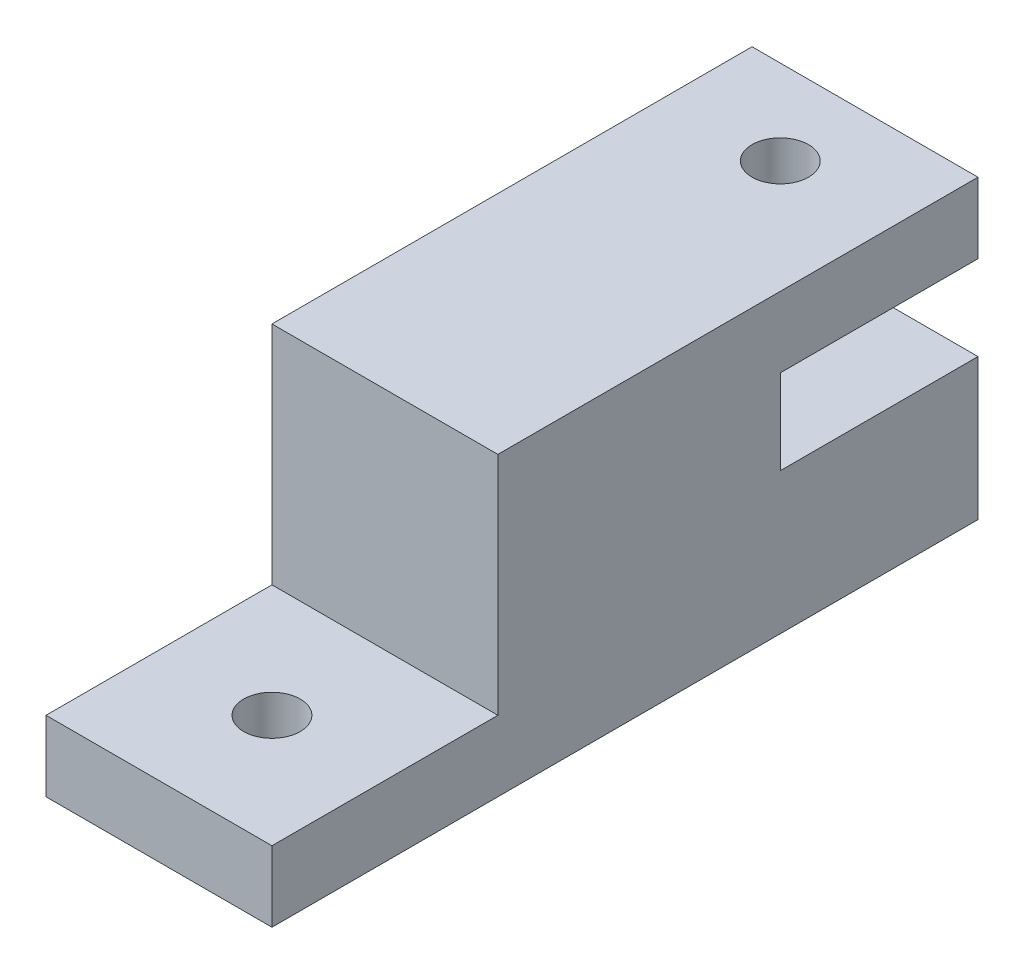
ISO-10303-21;
HEADER;
FILE_DESCRIPTION(('STEP AP214'),'2;1');
FILE_NAME('part.step','',(''),(''),'','','');
FILE_SCHEMA(('AUTOMOTIVE_DESIGN { 1 0 10303 214 1 1 1 1 }'));
ENDSEC;
DATA;
#1=APPLICATION_CONTEXT('core data for automotive mechanical design processes');
#2=APPLICATION_PROTOCOL_DEFINITION('international standard','automotive_design',2000,#1);
#3=PRODUCT_CONTEXT('',#1,'mechanical');
#4=PRODUCT('Part','Part','',(#3));
#5=PRODUCT_RELATED_PRODUCT_CATEGORY('part','',(#4));
#6=PRODUCT_DEFINITION_FORMATION('','',#4);
#7=PRODUCT_DEFINITION_CONTEXT('part definition',#1,'design');
#8=PRODUCT_DEFINITION('design','',#6,#7);
#9=PRODUCT_DEFINITION_SHAPE('','',#8);
#10=(LENGTH_UNIT() NAMED_UNIT(*) SI_UNIT(.MILLI.,.METRE.));
#11=(NAMED_UNIT(*) PLANE_ANGLE_UNIT() SI_UNIT($,.RADIAN.));
#12=(NAMED_UNIT(*) SI_UNIT($,.STERADIAN.) SOLID_ANGLE_UNIT());
#13=UNCERTAINTY_MEASURE_WITH_UNIT(LENGTH_MEASURE(1.E-05),#10,'distance_accuracy_value','');
#14=(GEOMETRIC_REPRESENTATION_CONTEXT(3) GLOBAL_UNCERTAINTY_ASSIGNED_CONTEXT((#13)) GLOBAL_UNIT_ASSIGNED_CONTEXT((#10,
#11,#12)) REPRESENTATION_CONTEXT('',''));
#15=CARTESIAN_POINT('',(0.,0.,0.));
#16=DIRECTION('',(0.,0.,1.));
#17=DIRECTION('',(1.,0.,0.));
#18=AXIS2_PLACEMENT_3D('',#15,#16,#17);
#19=CARTESIAN_POINT('',(12.7,25.4,0.));
#20=DIRECTION('',(0.,0.,-1.));
#21=DIRECTION('',(0.,1.,0.));
#22=AXIS2_PLACEMENT_3D('',#19,#20,#21);
#23=PLANE('',#22);
#24=DIRECTION('',(0.,-1.,0.));
#25=VECTOR('',#24,1.);
#26=CARTESIAN_POINT('',(-12.7,25.4,0.));
#27=LINE('',#26,#25);
#28=CARTESIAN_POINT('',(-12.7,25.4,0.));
#29=VERTEX_POINT('',#28);
#30=CARTESIAN_POINT('',(-12.7,0.,0.));
#31=VERTEX_POINT('',#30);
#32=EDGE_CURVE('E148',#29,#31,#27,.T.);
#33=ORIENTED_EDGE('',*,*,#32,.T.);
#34=DIRECTION('',(-1.,0.,0.));
#35=VECTOR('',#34,1.);
#36=CARTESIAN_POINT('',(12.7,0.,0.));
#37=LINE('',#36,#35);
#38=CARTESIAN_POINT('',(12.7,0.,0.));
#39=VERTEX_POINT('',#38);
#40=EDGE_CURVE('E12',#39,#31,#37,.T.);
#41=ORIENTED_EDGE('',*,*,#40,.F.);
#42=DIRECTION('',(0.,-1.,0.));
#43=VECTOR('',#42,1.);
#44=CARTESIAN_POINT('',(12.7,25.4,0.));
#45=LINE('',#44,#43);
#46=CARTESIAN_POINT('',(12.7,25.4,0.));
#47=VERTEX_POINT('',#46);
#48=EDGE_CURVE('E167',#47,#39,#45,.T.);
#49=ORIENTED_EDGE('',*,*,#48,.F.);
#50=DIRECTION('',(-1.,0.,0.));
#51=VECTOR('',#50,1.);
#52=CARTESIAN_POINT('',(12.7,25.4,0.));
#53=LINE('',#52,#51);
#54=EDGE_CURVE('E144',#47,#29,#53,.T.);
#55=ORIENTED_EDGE('',*,*,#54,.T.);
#56=EDGE_LOOP('',(#33,#41,#49,#55));
#57=FACE_BOUND('',#56,.T.);
#58=ADVANCED_FACE('F40',(#57),#23,.F.);
#59=CARTESIAN_POINT('',(12.7,0.,0.));
#60=DIRECTION('',(0.,-1.,0.));
#61=DIRECTION('',(0.,0.,-1.));
#62=AXIS2_PLACEMENT_3D('',#59,#60,#61);
#63=PLANE('',#62);
#64=CARTESIAN_POINT('',(0.,0.,12.7));
#65=DIRECTION('',(0.,-1.,0.));
#66=DIRECTION('',(0.,0.,-1.));
#67=AXIS2_PLACEMENT_3D('',#64,#65,#66);
#68=CIRCLE('',#67,3.175);
#69=CARTESIAN_POINT('',(0.,0.,9.525));
#70=VERTEX_POINT('',#69);
#71=EDGE_CURVE('E223',#70,#70,#68,.T.);
#72=ORIENTED_EDGE('',*,*,#71,.T.);
#73=EDGE_LOOP('',(#72));
#74=FACE_BOUND('',#73,.T.);
#75=DIRECTION('',(0.,0.,1.));
#76=VECTOR('',#75,1.);
#77=CARTESIAN_POINT('',(-12.7,0.,0.));
#78=LINE('',#77,#76);
#79=CARTESIAN_POINT('',(-12.7,0.,25.4));
#80=VERTEX_POINT('',#79);
#81=EDGE_CURVE('E151',#31,#80,#78,.T.);
#82=ORIENTED_EDGE('',*,*,#81,.T.);
#83=DIRECTION('',(-1.,0.,0.));
#84=VECTOR('',#83,1.);
#85=CARTESIAN_POINT('',(12.7,0.,25.4));
#86=LINE('',#85,#84);
#87=CARTESIAN_POINT('',(12.7,0.,25.4));
#88=VERTEX_POINT('',#87);
#89=EDGE_CURVE('E48',#88,#80,#86,.T.);
#90=ORIENTED_EDGE('',*,*,#89,.F.);
#91=DIRECTION('',(0.,0.,1.));
#92=VECTOR('',#91,1.);
#93=CARTESIAN_POINT('',(12.7,0.,0.));
#94=LINE('',#93,#92);
#95=EDGE_CURVE('E105',#39,#88,#94,.T.);
#96=ORIENTED_EDGE('',*,*,#95,.F.);
#97=ORIENTED_EDGE('',*,*,#40,.T.);
#98=EDGE_LOOP('',(#82,#90,#96,#97));
#99=FACE_BOUND('',#98,.T.);
#100=ADVANCED_FACE('F241',(#74,#99),#63,.F.);
#101=CARTESIAN_POINT('',(12.7,0.,25.4));
#102=DIRECTION('',(0.,0.,-1.));
#103=DIRECTION('',(-1.,0.,0.));
#104=AXIS2_PLACEMENT_3D('',#101,#102,#103);
#105=PLANE('',#104);
#106=DIRECTION('',(0.,-1.,0.));
#107=VECTOR('',#106,1.);
#108=CARTESIAN_POINT('',(-12.7,0.,25.4));
#109=LINE('',#108,#107);
#110=CARTESIAN_POINT('',(-12.7,-7.9375,25.4));
#111=VERTEX_POINT('',#110);
#112=EDGE_CURVE('E154',#80,#111,#109,.T.);
#113=ORIENTED_EDGE('',*,*,#112,.T.);
#114=DIRECTION('',(-1.,0.,0.));
#115=VECTOR('',#114,1.);
#116=CARTESIAN_POINT('',(12.7,-7.9375,25.4));
#117=LINE('',#116,#115);
#118=CARTESIAN_POINT('',(12.7,-7.9375,25.4));
#119=VERTEX_POINT('',#118);
#120=EDGE_CURVE('E180',#119,#111,#117,.T.);
#121=ORIENTED_EDGE('',*,*,#120,.F.);
#122=DIRECTION('',(0.,-1.,0.));
#123=VECTOR('',#122,1.);
#124=CARTESIAN_POINT('',(12.7,0.,25.4));
#125=LINE('',#124,#123);
#126=EDGE_CURVE('E188',#88,#119,#125,.T.);
#127=ORIENTED_EDGE('',*,*,#126,.F.);
#128=ORIENTED_EDGE('',*,*,#89,.T.);
#129=EDGE_LOOP('',(#113,#121,#127,#128));
#130=FACE_BOUND('',#129,.T.);
#131=ADVANCED_FACE('F186',(#130),#105,.F.);
#132=CARTESIAN_POINT('',(12.7,-7.9375,25.4));
#133=DIRECTION('',(0.,1.,0.));
#134=DIRECTION('',(0.,0.,1.));
#135=AXIS2_PLACEMENT_3D('',#132,#133,#134);
#136=PLANE('',#135);
#137=CARTESIAN_POINT('',(0.,-7.93750000000001,12.7));
#138=DIRECTION('',(0.,1.,0.));
#139=DIRECTION('',(0.,0.,1.));
#140=AXIS2_PLACEMENT_3D('',#137,#138,#139);
#141=CIRCLE('',#140,3.175);
#142=CARTESIAN_POINT('',(0.,-7.93750000000001,15.875));
#143=VERTEX_POINT('',#142);
#144=EDGE_CURVE('E228',#143,#143,#141,.T.);
#145=ORIENTED_EDGE('',*,*,#144,.T.);
#146=EDGE_LOOP('',(#145));
#147=FACE_BOUND('',#146,.T.);
#148=CARTESIAN_POINT('',(0.,-7.9375,-44.45));
#149=DIRECTION('',(0.,1.,0.));
#150=DIRECTION('',(0.,0.,1.));
#151=AXIS2_PLACEMENT_3D('',#148,#149,#150);
#152=CIRCLE('',#151,3.175);
#153=CARTESIAN_POINT('',(0.,-7.9375,-41.275));
#154=VERTEX_POINT('',#153);
#155=EDGE_CURVE('E219',#154,#154,#152,.T.);
#156=ORIENTED_EDGE('',*,*,#155,.T.);
#157=EDGE_LOOP('',(#156));
#158=FACE_BOUND('',#157,.T.);
#159=DIRECTION('',(0.,0.,-1.));
#160=VECTOR('',#159,1.);
#161=CARTESIAN_POINT('',(-12.7,-7.9375,25.4));
#162=LINE('',#161,#160);
#163=CARTESIAN_POINT('',(-12.7,-7.9375,-53.975));
#164=VERTEX_POINT('',#163);
#165=EDGE_CURVE('E156',#111,#164,#162,.T.);
#166=ORIENTED_EDGE('',*,*,#165,.T.);
#167=DIRECTION('',(-1.,0.,0.));
#168=VECTOR('',#167,1.);
#169=CARTESIAN_POINT('',(12.7,-7.9375,-53.975));
#170=LINE('',#169,#168);
#171=CARTESIAN_POINT('',(12.7,-7.9375,-53.975));
#172=VERTEX_POINT('',#171);
#173=EDGE_CURVE('E177',#172,#164,#170,.T.);
#174=ORIENTED_EDGE('',*,*,#173,.F.);
#175=DIRECTION('',(0.,0.,-1.));
#176=VECTOR('',#175,1.);
#177=CARTESIAN_POINT('',(12.7,-7.9375,25.4));
#178=LINE('',#177,#176);
#179=EDGE_CURVE('E206',#119,#172,#178,.T.);
#180=ORIENTED_EDGE('',*,*,#179,.F.);
#181=ORIENTED_EDGE('',*,*,#120,.T.);
#182=EDGE_LOOP('',(#166,#174,#180,#181));
#183=FACE_BOUND('',#182,.T.);
#184=ADVANCED_FACE('F197',(#147,#158,#183),#136,.F.);
#185=CARTESIAN_POINT('',(12.7,-7.9375,-53.975));
#186=DIRECTION('',(0.,0.,1.));
#187=DIRECTION('',(0.,-1.,0.));
#188=AXIS2_PLACEMENT_3D('',#185,#186,#187);
#189=PLANE('',#188);
#190=DIRECTION('',(0.,1.,0.));
#191=VECTOR('',#190,1.);
#192=CARTESIAN_POINT('',(-12.7,-7.9375,-53.975));
#193=LINE('',#192,#191);
#194=CARTESIAN_POINT('',(-12.7,7.9375,-53.975));
#195=VERTEX_POINT('',#194);
#196=EDGE_CURVE('E158',#164,#195,#193,.T.);
#197=ORIENTED_EDGE('',*,*,#196,.T.);
#198=DIRECTION('',(-1.,0.,0.));
#199=VECTOR('',#198,1.);
#200=CARTESIAN_POINT('',(12.7,7.9375,-53.975));
#201=LINE('',#200,#199);
#202=CARTESIAN_POINT('',(12.7,7.9375,-53.975));
#203=VERTEX_POINT('',#202);
#204=EDGE_CURVE('E174',#203,#195,#201,.T.);
#205=ORIENTED_EDGE('',*,*,#204,.F.);
#206=DIRECTION('',(0.,1.,0.));
#207=VECTOR('',#206,1.);
#208=CARTESIAN_POINT('',(12.7,-7.9375,-53.975));
#209=LINE('',#208,#207);
#210=EDGE_CURVE('E203',#172,#203,#209,.T.);
#211=ORIENTED_EDGE('',*,*,#210,.F.);
#212=ORIENTED_EDGE('',*,*,#173,.T.);
#213=EDGE_LOOP('',(#197,#205,#211,#212));
#214=FACE_BOUND('',#213,.T.);
#215=ADVANCED_FACE('F201',(#214),#189,.F.);
#216=CARTESIAN_POINT('',(12.7,7.9375,-31.75));
#217=DIRECTION('',(0.,-1.,0.));
#218=DIRECTION('',(0.,0.,-1.));
#219=AXIS2_PLACEMENT_3D('',#216,#217,#218);
#220=PLANE('',#219);
#221=CARTESIAN_POINT('',(0.,7.9375,-44.45));
#222=DIRECTION('',(0.,-1.,0.));
#223=DIRECTION('',(0.,0.,-1.));
#224=AXIS2_PLACEMENT_3D('',#221,#222,#223);
#225=CIRCLE('',#224,3.175);
#226=CARTESIAN_POINT('',(0.,7.9375,-47.625));
#227=VERTEX_POINT('',#226);
#228=EDGE_CURVE('E152',#227,#227,#225,.T.);
#229=ORIENTED_EDGE('',*,*,#228,.T.);
#230=EDGE_LOOP('',(#229));
#231=FACE_BOUND('',#230,.T.);
#232=DIRECTION('',(0.,0.,1.));
#233=VECTOR('',#232,1.);
#234=CARTESIAN_POINT('',(-12.7,7.9375,-31.75));
#235=LINE('',#234,#233);
#236=CARTESIAN_POINT('',(-12.7,7.9375,-31.75));
#237=VERTEX_POINT('',#236);
#238=EDGE_CURVE('E160',#195,#237,#235,.T.);
#239=ORIENTED_EDGE('',*,*,#238,.T.);
#240=DIRECTION('',(-1.,0.,0.));
#241=VECTOR('',#240,1.);
#242=CARTESIAN_POINT('',(12.7,7.9375,-31.75));
#243=LINE('',#242,#241);
#244=CARTESIAN_POINT('',(12.7,7.9375,-31.75));
#245=VERTEX_POINT('',#244);
#246=EDGE_CURVE('E171',#245,#237,#243,.T.);
#247=ORIENTED_EDGE('',*,*,#246,.F.);
#248=DIRECTION('',(0.,0.,1.));
#249=VECTOR('',#248,1.);
#250=CARTESIAN_POINT('',(12.7,7.9375,-31.75));
#251=LINE('',#250,#249);
#252=EDGE_CURVE('E205',#203,#245,#251,.T.);
#253=ORIENTED_EDGE('',*,*,#252,.F.);
#254=ORIENTED_EDGE('',*,*,#204,.T.);
#255=EDGE_LOOP('',(#239,#247,#253,#254));
#256=FACE_BOUND('',#255,.T.);
#257=ADVANCED_FACE('F251',(#231,#256),#220,.F.);
#258=CARTESIAN_POINT('',(12.7,17.4625,-31.75));
#259=DIRECTION('',(0.,0.,1.));
#260=DIRECTION('',(1.,0.,0.));
#261=AXIS2_PLACEMENT_3D('',#258,#259,#260);
#262=PLANE('',#261);
#263=DIRECTION('',(0.,1.,0.));
#264=VECTOR('',#263,1.);
#265=CARTESIAN_POINT('',(-12.7,17.4625,-31.75));
#266=LINE('',#265,#264);
#267=CARTESIAN_POINT('',(-12.7,17.4625,-31.75));
#268=VERTEX_POINT('',#267);
#269=EDGE_CURVE('E162',#237,#268,#266,.T.);
#270=ORIENTED_EDGE('',*,*,#269,.T.);
#271=DIRECTION('',(-1.,0.,0.));
#272=VECTOR('',#271,1.);
#273=CARTESIAN_POINT('',(12.7,17.4625,-31.75));
#274=LINE('',#273,#272);
#275=CARTESIAN_POINT('',(12.7,17.4625,-31.75));
#276=VERTEX_POINT('',#275);
#277=EDGE_CURVE('E139',#276,#268,#274,.T.);
#278=ORIENTED_EDGE('',*,*,#277,.F.);
#279=DIRECTION('',(0.,1.,0.));
#280=VECTOR('',#279,1.);
#281=CARTESIAN_POINT('',(12.7,17.4625,-31.75));
#282=LINE('',#281,#280);
#283=EDGE_CURVE('E130',#245,#276,#282,.T.);
#284=ORIENTED_EDGE('',*,*,#283,.F.);
#285=ORIENTED_EDGE('',*,*,#246,.T.);
#286=EDGE_LOOP('',(#270,#278,#284,#285));
#287=FACE_BOUND('',#286,.T.);
#288=ADVANCED_FACE('F248',(#287),#262,.F.);
#289=CARTESIAN_POINT('',(12.7,17.4625,-53.975));
#290=DIRECTION('',(0.,1.,0.));
#291=DIRECTION('',(0.,0.,1.));
#292=AXIS2_PLACEMENT_3D('',#289,#290,#291);
#293=PLANE('',#292);
#294=CARTESIAN_POINT('',(0.,17.4625,-44.45));
#295=DIRECTION('',(0.,1.,0.));
#296=DIRECTION('',(0.,0.,1.));
#297=AXIS2_PLACEMENT_3D('',#294,#295,#296);
#298=CIRCLE('',#297,3.175);
#299=CARTESIAN_POINT('',(0.,17.4625,-41.275));
#300=VERTEX_POINT('',#299);
#301=EDGE_CURVE('E216',#300,#300,#298,.T.);
#302=ORIENTED_EDGE('',*,*,#301,.T.);
#303=EDGE_LOOP('',(#302));
#304=FACE_BOUND('',#303,.T.);
#305=DIRECTION('',(0.,0.,-1.));
#306=VECTOR('',#305,1.);
#307=CARTESIAN_POINT('',(-12.7,17.4625,-53.975));
#308=LINE('',#307,#306);
#309=CARTESIAN_POINT('',(-12.7,17.4625,-53.975));
#310=VERTEX_POINT('',#309);
#311=EDGE_CURVE('E138',#268,#310,#308,.T.);
#312=ORIENTED_EDGE('',*,*,#311,.T.);
#313=DIRECTION('',(-1.,0.,0.));
#314=VECTOR('',#313,1.);
#315=CARTESIAN_POINT('',(12.7,17.4625,-53.975));
#316=LINE('',#315,#314);
#317=CARTESIAN_POINT('',(12.7,17.4625,-53.975));
#318=VERTEX_POINT('',#317);
#319=EDGE_CURVE('E135',#318,#310,#316,.T.);
#320=ORIENTED_EDGE('',*,*,#319,.F.);
#321=DIRECTION('',(0.,0.,-1.));
#322=VECTOR('',#321,1.);
#323=CARTESIAN_POINT('',(12.7,17.4625,-53.975));
#324=LINE('',#323,#322);
#325=EDGE_CURVE('E124',#276,#318,#324,.T.);
#326=ORIENTED_EDGE('',*,*,#325,.F.);
#327=ORIENTED_EDGE('',*,*,#277,.T.);
#328=EDGE_LOOP('',(#312,#320,#326,#327));
#329=FACE_BOUND('',#328,.T.);
#330=ADVANCED_FACE('F136',(#304,#329),#293,.F.);
#331=CARTESIAN_POINT('',(12.7,17.4625,-53.975));
#332=DIRECTION('',(0.,0.,1.));
#333=DIRECTION('',(1.,0.,0.));
#334=AXIS2_PLACEMENT_3D('',#331,#332,#333);
#335=PLANE('',#334);
#336=DIRECTION('',(0.,1.,0.));
#337=VECTOR('',#336,1.);
#338=CARTESIAN_POINT('',(-12.7,17.4625,-53.975));
#339=LINE('',#338,#337);
#340=CARTESIAN_POINT('',(-12.7,25.4,-53.975));
#341=VERTEX_POINT('',#340);
#342=EDGE_CURVE('E91',#310,#341,#339,.T.);
#343=ORIENTED_EDGE('',*,*,#342,.T.);
#344=DIRECTION('',(-1.,0.,0.));
#345=VECTOR('',#344,1.);
#346=CARTESIAN_POINT('',(12.7,25.4,-53.975));
#347=LINE('',#346,#345);
#348=CARTESIAN_POINT('',(12.7,25.4,-53.975));
#349=VERTEX_POINT('',#348);
#350=EDGE_CURVE('E140',#349,#341,#347,.T.);
#351=ORIENTED_EDGE('',*,*,#350,.F.);
#352=DIRECTION('',(0.,1.,0.));
#353=VECTOR('',#352,1.);
#354=CARTESIAN_POINT('',(12.7,17.4625,-53.975));
#355=LINE('',#354,#353);
#356=EDGE_CURVE('E128',#318,#349,#355,.T.);
#357=ORIENTED_EDGE('',*,*,#356,.F.);
#358=ORIENTED_EDGE('',*,*,#319,.T.);
#359=EDGE_LOOP('',(#343,#351,#357,#358));
#360=FACE_BOUND('',#359,.T.);
#361=ADVANCED_FACE('F142',(#360),#335,.F.);
#362=CARTESIAN_POINT('',(12.7,25.4,-53.975));
#363=DIRECTION('',(0.,-1.,0.));
#364=DIRECTION('',(0.,0.,-1.));
#365=AXIS2_PLACEMENT_3D('',#362,#363,#364);
#366=PLANE('',#365);
#367=CARTESIAN_POINT('',(0.,25.4,-44.45));
#368=DIRECTION('',(0.,1.,0.));
#369=DIRECTION('',(0.,0.,1.));
#370=AXIS2_PLACEMENT_3D('',#367,#368,#369);
#371=CIRCLE('',#370,3.175);
#372=CARTESIAN_POINT('',(0.,25.4,-41.275));
#373=VERTEX_POINT('',#372);
#374=EDGE_CURVE('E220',#373,#373,#371,.T.);
#375=ORIENTED_EDGE('',*,*,#374,.F.);
#376=EDGE_LOOP('',(#375));
#377=FACE_BOUND('',#376,.T.);
#378=DIRECTION('',(0.,0.,1.));
#379=VECTOR('',#378,1.);
#380=CARTESIAN_POINT('',(-12.7,25.4,-53.975));
#381=LINE('',#380,#379);
#382=EDGE_CURVE('E97',#341,#29,#381,.T.);
#383=ORIENTED_EDGE('',*,*,#382,.T.);
#384=ORIENTED_EDGE('',*,*,#54,.F.);
#385=DIRECTION('',(0.,0.,1.));
#386=VECTOR('',#385,1.);
#387=CARTESIAN_POINT('',(12.7,25.4,-53.975));
#388=LINE('',#387,#386);
#389=EDGE_CURVE('E56',#349,#47,#388,.T.);
#390=ORIENTED_EDGE('',*,*,#389,.F.);
#391=ORIENTED_EDGE('',*,*,#350,.T.);
#392=EDGE_LOOP('',(#383,#384,#390,#391));
#393=FACE_BOUND('',#392,.T.);
#394=ADVANCED_FACE('F289',(#377,#393),#366,.F.);
#395=CARTESIAN_POINT('',(12.7,0.,0.));
#396=DIRECTION('',(-1.,0.,0.));
#397=DIRECTION('',(0.,0.,1.));
#398=AXIS2_PLACEMENT_3D('',#395,#396,#397);
#399=PLANE('',#398);
#400=ORIENTED_EDGE('',*,*,#48,.T.);
#401=ORIENTED_EDGE('',*,*,#95,.T.);
#402=ORIENTED_EDGE('',*,*,#126,.T.);
#403=ORIENTED_EDGE('',*,*,#179,.T.);
#404=ORIENTED_EDGE('',*,*,#210,.T.);
#405=ORIENTED_EDGE('',*,*,#252,.T.);
#406=ORIENTED_EDGE('',*,*,#283,.T.);
#407=ORIENTED_EDGE('',*,*,#325,.T.);
#408=ORIENTED_EDGE('',*,*,#356,.T.);
#409=ORIENTED_EDGE('',*,*,#389,.T.);
#410=EDGE_LOOP('',(#400,#401,#402,#403,#404,#405,#406,#407,#408,#409));
#411=FACE_BOUND('',#410,.T.);
#412=ADVANCED_FACE('F126',(#411),#399,.F.);
#413=CARTESIAN_POINT('',(-12.7,0.,0.));
#414=DIRECTION('',(-1.,0.,0.));
#415=DIRECTION('',(0.,0.,1.));
#416=AXIS2_PLACEMENT_3D('',#413,#414,#415);
#417=PLANE('',#416);
#418=ORIENTED_EDGE('',*,*,#32,.F.);
#419=ORIENTED_EDGE('',*,*,#382,.F.);
#420=ORIENTED_EDGE('',*,*,#342,.F.);
#421=ORIENTED_EDGE('',*,*,#311,.F.);
#422=ORIENTED_EDGE('',*,*,#269,.F.);
#423=ORIENTED_EDGE('',*,*,#238,.F.);
#424=ORIENTED_EDGE('',*,*,#196,.F.);
#425=ORIENTED_EDGE('',*,*,#165,.F.);
#426=ORIENTED_EDGE('',*,*,#112,.F.);
#427=ORIENTED_EDGE('',*,*,#81,.F.);
#428=EDGE_LOOP('',(#418,#419,#420,#421,#422,#423,#424,#425,#426,#427));
#429=FACE_BOUND('',#428,.T.);
#430=ADVANCED_FACE('F192',(#429),#417,.T.);
#431=CARTESIAN_POINT('',(0.,-7.9375,-44.45));
#432=DIRECTION('',(0.,1.,0.));
#433=DIRECTION('',(0.,0.,1.));
#434=AXIS2_PLACEMENT_3D('',#431,#432,#433);
#435=CYLINDRICAL_SURFACE('',#434,3.175);
#436=ORIENTED_EDGE('',*,*,#374,.T.);
#437=EDGE_LOOP('',(#436));
#438=FACE_BOUND('',#437,.T.);
#439=ORIENTED_EDGE('',*,*,#301,.F.);
#440=EDGE_LOOP('',(#439));
#441=FACE_BOUND('',#440,.T.);
#442=ADVANCED_FACE('F302',(#438,#441),#435,.F.);
#443=ORIENTED_EDGE('',*,*,#155,.F.);
#444=EDGE_LOOP('',(#443));
#445=FACE_BOUND('',#444,.T.);
#446=ORIENTED_EDGE('',*,*,#228,.F.);
#447=EDGE_LOOP('',(#446));
#448=FACE_BOUND('',#447,.T.);
#449=ADVANCED_FACE('F237',(#445,#448),#435,.F.);
#450=CARTESIAN_POINT('',(0.,-7.93750000000001,12.7));
#451=DIRECTION('',(0.,1.,0.));
#452=DIRECTION('',(0.,0.,1.));
#453=AXIS2_PLACEMENT_3D('',#450,#451,#452);
#454=CYLINDRICAL_SURFACE('',#453,3.175);
#455=ORIENTED_EDGE('',*,*,#144,.F.);
#456=EDGE_LOOP('',(#455));
#457=FACE_BOUND('',#456,.T.);
#458=ORIENTED_EDGE('',*,*,#71,.F.);
#459=EDGE_LOOP('',(#458));
#460=FACE_BOUND('',#459,.T.);
#461=ADVANCED_FACE('F234',(#457,#460),#454,.F.);
#462=CLOSED_SHELL('',(#58,#100,#131,#184,#215,#257,#288,#330,#361,#394,#412,#430,#442,#449,#461));
#463=MANIFOLD_SOLID_BREP('B2',#462);
#464=ADVANCED_BREP_SHAPE_REPRESENTATION('',(#18,#463),#14);
#465=SHAPE_DEFINITION_REPRESENTATION(#9,#464);
ENDSEC;
END-ISO-10303-21;
